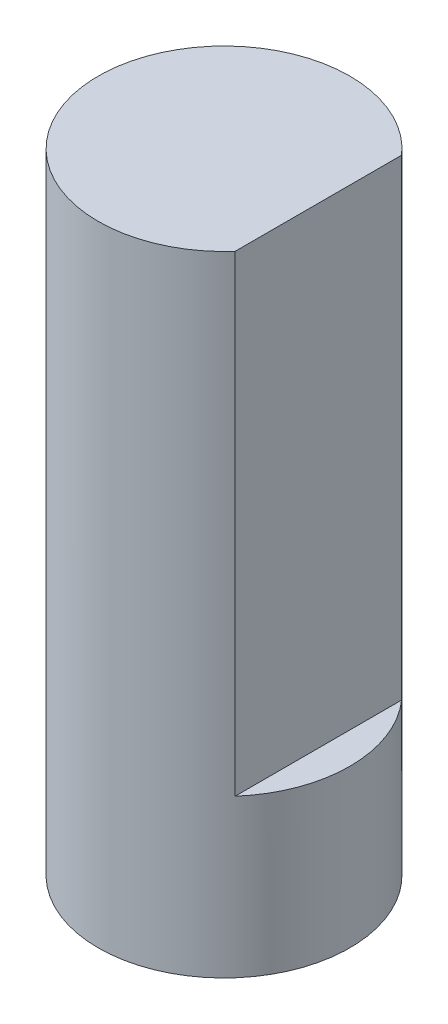
ISO-10303-21;
HEADER;
FILE_DESCRIPTION(('STEP AP214'),'2;1');
FILE_NAME('part.step','',(''),(''),'','','');
FILE_SCHEMA(('AUTOMOTIVE_DESIGN { 1 0 10303 214 1 1 1 1 }'));
ENDSEC;
DATA;
#1=APPLICATION_CONTEXT('core data for automotive mechanical design processes');
#2=APPLICATION_PROTOCOL_DEFINITION('international standard','automotive_design',2000,#1);
#3=PRODUCT_CONTEXT('',#1,'mechanical');
#4=PRODUCT('Part','Part','',(#3));
#5=PRODUCT_RELATED_PRODUCT_CATEGORY('part','',(#4));
#6=PRODUCT_DEFINITION_FORMATION('','',#4);
#7=PRODUCT_DEFINITION_CONTEXT('part definition',#1,'design');
#8=PRODUCT_DEFINITION('design','',#6,#7);
#9=PRODUCT_DEFINITION_SHAPE('','',#8);
#10=(LENGTH_UNIT() NAMED_UNIT(*) SI_UNIT(.MILLI.,.METRE.));
#11=(NAMED_UNIT(*) PLANE_ANGLE_UNIT() SI_UNIT($,.RADIAN.));
#12=(NAMED_UNIT(*) SI_UNIT($,.STERADIAN.) SOLID_ANGLE_UNIT());
#13=UNCERTAINTY_MEASURE_WITH_UNIT(LENGTH_MEASURE(1.E-05),#10,'distance_accuracy_value','');
#14=(GEOMETRIC_REPRESENTATION_CONTEXT(3) GLOBAL_UNCERTAINTY_ASSIGNED_CONTEXT((#13)) GLOBAL_UNIT_ASSIGNED_CONTEXT((#10,
#11,#12)) REPRESENTATION_CONTEXT('',''));
#15=CARTESIAN_POINT('',(0.,0.,0.));
#16=DIRECTION('',(0.,0.,1.));
#17=DIRECTION('',(1.,0.,0.));
#18=AXIS2_PLACEMENT_3D('',#15,#16,#17);
#19=CARTESIAN_POINT('',(0.,20.,0.));
#20=DIRECTION('',(0.,-1.,0.));
#21=DIRECTION('',(0.,0.,-1.));
#22=AXIS2_PLACEMENT_3D('',#19,#20,#21);
#23=CYLINDRICAL_SURFACE('',#22,4.);
#24=CARTESIAN_POINT('',(0.,20.,0.));
#25=DIRECTION('',(0.,1.,0.));
#26=DIRECTION('',(0.,0.,1.));
#27=AXIS2_PLACEMENT_3D('',#24,#25,#26);
#28=CIRCLE('',#27,4.);
#29=CARTESIAN_POINT('',(3.,20.,-2.64575131106459));
#30=VERTEX_POINT('',#29);
#31=CARTESIAN_POINT('',(3.,20.,2.64575131106459));
#32=VERTEX_POINT('',#31);
#33=EDGE_CURVE('E11',#30,#32,#28,.T.);
#34=ORIENTED_EDGE('',*,*,#33,.F.);
#35=DIRECTION('',(0.,1.,0.));
#36=VECTOR('',#35,1.);
#37=CARTESIAN_POINT('',(3.,5.,-2.64575131106459));
#38=LINE('',#37,#36);
#39=CARTESIAN_POINT('',(3.,5.,-2.64575131106459));
#40=VERTEX_POINT('',#39);
#41=EDGE_CURVE('E54',#40,#30,#38,.T.);
#42=ORIENTED_EDGE('',*,*,#41,.F.);
#43=CARTESIAN_POINT('',(0.,5.,0.));
#44=DIRECTION('',(0.,1.,0.));
#45=DIRECTION('',(0.,0.,1.));
#46=AXIS2_PLACEMENT_3D('',#43,#44,#45);
#47=CIRCLE('',#46,4.);
#48=CARTESIAN_POINT('',(3.,5.,2.64575131106459));
#49=VERTEX_POINT('',#48);
#50=EDGE_CURVE('E70',#49,#40,#47,.T.);
#51=ORIENTED_EDGE('',*,*,#50,.F.);
#52=DIRECTION('',(0.,1.,0.));
#53=VECTOR('',#52,1.);
#54=CARTESIAN_POINT('',(3.,5.,2.64575131106459));
#55=LINE('',#54,#53);
#56=EDGE_CURVE('E60',#49,#32,#55,.T.);
#57=ORIENTED_EDGE('',*,*,#56,.T.);
#58=EDGE_LOOP('',(#34,#42,#51,#57));
#59=FACE_BOUND('',#58,.T.);
#60=CARTESIAN_POINT('',(0.,0.,0.));
#61=DIRECTION('',(0.,1.,0.));
#62=DIRECTION('',(0.,0.,1.));
#63=AXIS2_PLACEMENT_3D('',#60,#61,#62);
#64=CIRCLE('',#63,4.);
#65=CARTESIAN_POINT('',(0.,0.,4.));
#66=VERTEX_POINT('',#65);
#67=EDGE_CURVE('E42',#66,#66,#64,.T.);
#68=ORIENTED_EDGE('',*,*,#67,.T.);
#69=EDGE_LOOP('',(#68));
#70=FACE_BOUND('',#69,.T.);
#71=ADVANCED_FACE('F39',(#59,#70),#23,.T.);
#72=CARTESIAN_POINT('',(0.,20.,0.));
#73=DIRECTION('',(0.,1.,0.));
#74=DIRECTION('',(0.,0.,1.));
#75=AXIS2_PLACEMENT_3D('',#72,#73,#74);
#76=PLANE('',#75);
#77=DIRECTION('',(0.,0.,1.));
#78=VECTOR('',#77,1.);
#79=CARTESIAN_POINT('',(3.,20.,-2.64575131106459));
#80=LINE('',#79,#78);
#81=EDGE_CURVE('E65',#30,#32,#80,.T.);
#82=ORIENTED_EDGE('',*,*,#81,.F.);
#83=ORIENTED_EDGE('',*,*,#33,.T.);
#84=EDGE_LOOP('',(#82,#83));
#85=FACE_BOUND('',#84,.T.);
#86=ADVANCED_FACE('F77',(#85),#76,.T.);
#87=CARTESIAN_POINT('',(0.,0.,0.));
#88=DIRECTION('',(0.,1.,0.));
#89=DIRECTION('',(0.,0.,1.));
#90=AXIS2_PLACEMENT_3D('',#87,#88,#89);
#91=PLANE('',#90);
#92=ORIENTED_EDGE('',*,*,#67,.F.);
#93=EDGE_LOOP('',(#92));
#94=FACE_BOUND('',#93,.T.);
#95=ADVANCED_FACE('F79',(#94),#91,.F.);
#96=CARTESIAN_POINT('',(3.,5.,-2.64575131106459));
#97=DIRECTION('',(-1.,0.,0.));
#98=DIRECTION('',(0.,0.,1.));
#99=AXIS2_PLACEMENT_3D('',#96,#97,#98);
#100=PLANE('',#99);
#101=ORIENTED_EDGE('',*,*,#81,.T.);
#102=ORIENTED_EDGE('',*,*,#56,.F.);
#103=DIRECTION('',(0.,0.,1.));
#104=VECTOR('',#103,1.);
#105=CARTESIAN_POINT('',(3.,5.,-2.64575131106459));
#106=LINE('',#105,#104);
#107=EDGE_CURVE('E94',#40,#49,#106,.T.);
#108=ORIENTED_EDGE('',*,*,#107,.F.);
#109=ORIENTED_EDGE('',*,*,#41,.T.);
#110=EDGE_LOOP('',(#101,#102,#108,#109));
#111=FACE_BOUND('',#110,.T.);
#112=ADVANCED_FACE('F66',(#111),#100,.F.);
#113=CARTESIAN_POINT('',(0.,5.,0.));
#114=DIRECTION('',(0.,1.,0.));
#115=DIRECTION('',(0.,0.,1.));
#116=AXIS2_PLACEMENT_3D('',#113,#114,#115);
#117=PLANE('',#116);
#118=ORIENTED_EDGE('',*,*,#50,.T.);
#119=ORIENTED_EDGE('',*,*,#107,.T.);
#120=EDGE_LOOP('',(#118,#119));
#121=FACE_BOUND('',#120,.T.);
#122=ADVANCED_FACE('F89',(#121),#117,.T.);
#123=CLOSED_SHELL('',(#71,#86,#95,#112,#122));
#124=MANIFOLD_SOLID_BREP('B2',#123);
#125=ADVANCED_BREP_SHAPE_REPRESENTATION('',(#18,#124),#14);
#126=SHAPE_DEFINITION_REPRESENTATION(#9,#125);
ENDSEC;
END-ISO-10303-21;
